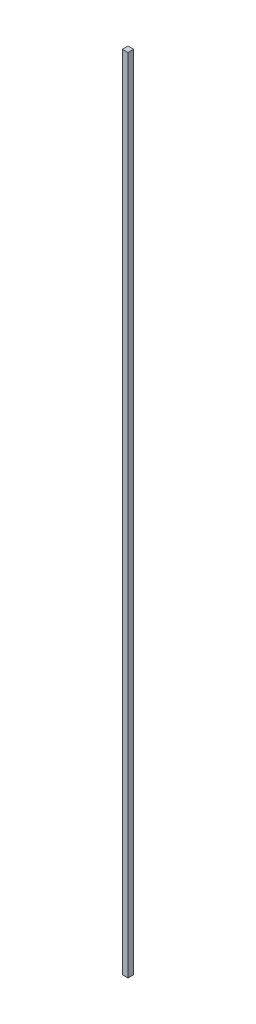
ISO-10303-21;
HEADER;
FILE_DESCRIPTION(('STEP AP214'),'2;1');
FILE_NAME('part.step','',(''),(''),'','','');
FILE_SCHEMA(('AUTOMOTIVE_DESIGN { 1 0 10303 214 1 1 1 1 }'));
ENDSEC;
DATA;
#1=APPLICATION_CONTEXT('core data for automotive mechanical design processes');
#2=APPLICATION_PROTOCOL_DEFINITION('international standard','automotive_design',2000,#1);
#3=PRODUCT_CONTEXT('',#1,'mechanical');
#4=PRODUCT('Part','Part','',(#3));
#5=PRODUCT_RELATED_PRODUCT_CATEGORY('part','',(#4));
#6=PRODUCT_DEFINITION_FORMATION('','',#4);
#7=PRODUCT_DEFINITION_CONTEXT('part definition',#1,'design');
#8=PRODUCT_DEFINITION('design','',#6,#7);
#9=PRODUCT_DEFINITION_SHAPE('','',#8);
#10=(LENGTH_UNIT() NAMED_UNIT(*) SI_UNIT(.MILLI.,.METRE.));
#11=(NAMED_UNIT(*) PLANE_ANGLE_UNIT() SI_UNIT($,.RADIAN.));
#12=(NAMED_UNIT(*) SI_UNIT($,.STERADIAN.) SOLID_ANGLE_UNIT());
#13=UNCERTAINTY_MEASURE_WITH_UNIT(LENGTH_MEASURE(1.E-05),#10,'distance_accuracy_value','');
#14=(GEOMETRIC_REPRESENTATION_CONTEXT(3) GLOBAL_UNCERTAINTY_ASSIGNED_CONTEXT((#13)) GLOBAL_UNIT_ASSIGNED_CONTEXT((#10,
#11,#12)) REPRESENTATION_CONTEXT('',''));
#15=CARTESIAN_POINT('',(0.,0.,0.));
#16=DIRECTION('',(0.,0.,1.));
#17=DIRECTION('',(1.,0.,0.));
#18=AXIS2_PLACEMENT_3D('',#15,#16,#17);
#19=CARTESIAN_POINT('',(3.99999999999993,570.,4.));
#20=DIRECTION('',(-1.,0.,0.));
#21=DIRECTION('',(0.,-1.,0.));
#22=AXIS2_PLACEMENT_3D('',#19,#20,#21);
#23=PLANE('',#22);
#24=DIRECTION('',(0.,1.,0.));
#25=VECTOR('',#24,1.);
#26=CARTESIAN_POINT('',(3.99999999999993,570.,0.));
#27=LINE('',#26,#25);
#28=CARTESIAN_POINT('',(4.,0.,0.));
#29=VERTEX_POINT('',#28);
#30=CARTESIAN_POINT('',(3.99999999999993,570.,0.));
#31=VERTEX_POINT('',#30);
#32=EDGE_CURVE('E96',#29,#31,#27,.T.);
#33=ORIENTED_EDGE('',*,*,#32,.T.);
#34=DIRECTION('',(0.,0.,-1.));
#35=VECTOR('',#34,1.);
#36=CARTESIAN_POINT('',(3.99999999999993,570.,4.));
#37=LINE('',#36,#35);
#38=CARTESIAN_POINT('',(3.99999999999993,570.,4.));
#39=VERTEX_POINT('',#38);
#40=EDGE_CURVE('E11',#39,#31,#37,.T.);
#41=ORIENTED_EDGE('',*,*,#40,.F.);
#42=DIRECTION('',(0.,1.,0.));
#43=VECTOR('',#42,1.);
#44=CARTESIAN_POINT('',(3.99999999999993,570.,4.));
#45=LINE('',#44,#43);
#46=CARTESIAN_POINT('',(4.,0.,4.));
#47=VERTEX_POINT('',#46);
#48=EDGE_CURVE('E84',#47,#39,#45,.T.);
#49=ORIENTED_EDGE('',*,*,#48,.F.);
#50=DIRECTION('',(0.,0.,-1.));
#51=VECTOR('',#50,1.);
#52=CARTESIAN_POINT('',(4.,0.,4.));
#53=LINE('',#52,#51);
#54=EDGE_CURVE('E92',#47,#29,#53,.T.);
#55=ORIENTED_EDGE('',*,*,#54,.T.);
#56=EDGE_LOOP('',(#33,#41,#49,#55));
#57=FACE_BOUND('',#56,.T.);
#58=ADVANCED_FACE('F33',(#57),#23,.F.);
#59=CARTESIAN_POINT('',(3.99999999999993,570.,4.));
#60=DIRECTION('',(0.,-1.,0.));
#61=DIRECTION('',(0.,0.,-1.));
#62=AXIS2_PLACEMENT_3D('',#59,#60,#61);
#63=PLANE('',#62);
#64=DIRECTION('',(-1.,0.,0.));
#65=VECTOR('',#64,1.);
#66=CARTESIAN_POINT('',(3.99999999999993,570.,0.));
#67=LINE('',#66,#65);
#68=CARTESIAN_POINT('',(0.,570.,0.));
#69=VERTEX_POINT('',#68);
#70=EDGE_CURVE('E88',#31,#69,#67,.T.);
#71=ORIENTED_EDGE('',*,*,#70,.T.);
#72=DIRECTION('',(0.,0.,-1.));
#73=VECTOR('',#72,1.);
#74=CARTESIAN_POINT('',(0.,570.,4.));
#75=LINE('',#74,#73);
#76=CARTESIAN_POINT('',(0.,570.,4.));
#77=VERTEX_POINT('',#76);
#78=EDGE_CURVE('E41',#77,#69,#75,.T.);
#79=ORIENTED_EDGE('',*,*,#78,.F.);
#80=DIRECTION('',(-1.,0.,0.));
#81=VECTOR('',#80,1.);
#82=CARTESIAN_POINT('',(3.99999999999993,570.,4.));
#83=LINE('',#82,#81);
#84=EDGE_CURVE('E79',#39,#77,#83,.T.);
#85=ORIENTED_EDGE('',*,*,#84,.F.);
#86=ORIENTED_EDGE('',*,*,#40,.T.);
#87=EDGE_LOOP('',(#71,#79,#85,#86));
#88=FACE_BOUND('',#87,.T.);
#89=ADVANCED_FACE('F87',(#88),#63,.F.);
#90=CARTESIAN_POINT('',(0.,570.,4.));
#91=DIRECTION('',(1.,0.,0.));
#92=DIRECTION('',(0.,0.,-1.));
#93=AXIS2_PLACEMENT_3D('',#90,#91,#92);
#94=PLANE('',#93);
#95=DIRECTION('',(0.,-1.,0.));
#96=VECTOR('',#95,1.);
#97=CARTESIAN_POINT('',(0.,570.,0.));
#98=LINE('',#97,#96);
#99=CARTESIAN_POINT('',(0.,0.,0.));
#100=VERTEX_POINT('',#99);
#101=EDGE_CURVE('E66',#69,#100,#98,.T.);
#102=ORIENTED_EDGE('',*,*,#101,.T.);
#103=DIRECTION('',(0.,0.,-1.));
#104=VECTOR('',#103,1.);
#105=CARTESIAN_POINT('',(0.,0.,4.));
#106=LINE('',#105,#104);
#107=CARTESIAN_POINT('',(0.,0.,4.));
#108=VERTEX_POINT('',#107);
#109=EDGE_CURVE('E89',#108,#100,#106,.T.);
#110=ORIENTED_EDGE('',*,*,#109,.F.);
#111=DIRECTION('',(0.,-1.,0.));
#112=VECTOR('',#111,1.);
#113=CARTESIAN_POINT('',(0.,570.,4.));
#114=LINE('',#113,#112);
#115=EDGE_CURVE('E82',#77,#108,#114,.T.);
#116=ORIENTED_EDGE('',*,*,#115,.F.);
#117=ORIENTED_EDGE('',*,*,#78,.T.);
#118=EDGE_LOOP('',(#102,#110,#116,#117));
#119=FACE_BOUND('',#118,.T.);
#120=ADVANCED_FACE('F90',(#119),#94,.F.);
#121=CARTESIAN_POINT('',(4.,0.,4.));
#122=DIRECTION('',(0.,1.,0.));
#123=DIRECTION('',(0.,0.,1.));
#124=AXIS2_PLACEMENT_3D('',#121,#122,#123);
#125=PLANE('',#124);
#126=DIRECTION('',(1.,0.,0.));
#127=VECTOR('',#126,1.);
#128=CARTESIAN_POINT('',(4.,0.,0.));
#129=LINE('',#128,#127);
#130=EDGE_CURVE('E72',#100,#29,#129,.T.);
#131=ORIENTED_EDGE('',*,*,#130,.T.);
#132=ORIENTED_EDGE('',*,*,#54,.F.);
#133=DIRECTION('',(1.,0.,0.));
#134=VECTOR('',#133,1.);
#135=CARTESIAN_POINT('',(4.,0.,4.));
#136=LINE('',#135,#134);
#137=EDGE_CURVE('E49',#108,#47,#136,.T.);
#138=ORIENTED_EDGE('',*,*,#137,.F.);
#139=ORIENTED_EDGE('',*,*,#109,.T.);
#140=EDGE_LOOP('',(#131,#132,#138,#139));
#141=FACE_BOUND('',#140,.T.);
#142=ADVANCED_FACE('F103',(#141),#125,.F.);
#143=CARTESIAN_POINT('',(0.,0.,4.));
#144=DIRECTION('',(0.,0.,-1.));
#145=DIRECTION('',(-1.,0.,0.));
#146=AXIS2_PLACEMENT_3D('',#143,#144,#145);
#147=PLANE('',#146);
#148=ORIENTED_EDGE('',*,*,#48,.T.);
#149=ORIENTED_EDGE('',*,*,#84,.T.);
#150=ORIENTED_EDGE('',*,*,#115,.T.);
#151=ORIENTED_EDGE('',*,*,#137,.T.);
#152=EDGE_LOOP('',(#148,#149,#150,#151));
#153=FACE_BOUND('',#152,.T.);
#154=ADVANCED_FACE('F80',(#153),#147,.F.);
#155=CARTESIAN_POINT('',(0.,0.,0.));
#156=DIRECTION('',(0.,0.,-1.));
#157=DIRECTION('',(-1.,0.,0.));
#158=AXIS2_PLACEMENT_3D('',#155,#156,#157);
#159=PLANE('',#158);
#160=ORIENTED_EDGE('',*,*,#32,.F.);
#161=ORIENTED_EDGE('',*,*,#130,.F.);
#162=ORIENTED_EDGE('',*,*,#101,.F.);
#163=ORIENTED_EDGE('',*,*,#70,.F.);
#164=EDGE_LOOP('',(#160,#161,#162,#163));
#165=FACE_BOUND('',#164,.T.);
#166=ADVANCED_FACE('F106',(#165),#159,.T.);
#167=CLOSED_SHELL('',(#58,#89,#120,#142,#154,#166));
#168=MANIFOLD_SOLID_BREP('B2',#167);
#169=ADVANCED_BREP_SHAPE_REPRESENTATION('',(#18,#168),#14);
#170=SHAPE_DEFINITION_REPRESENTATION(#9,#169);
ENDSEC;
END-ISO-10303-21;
